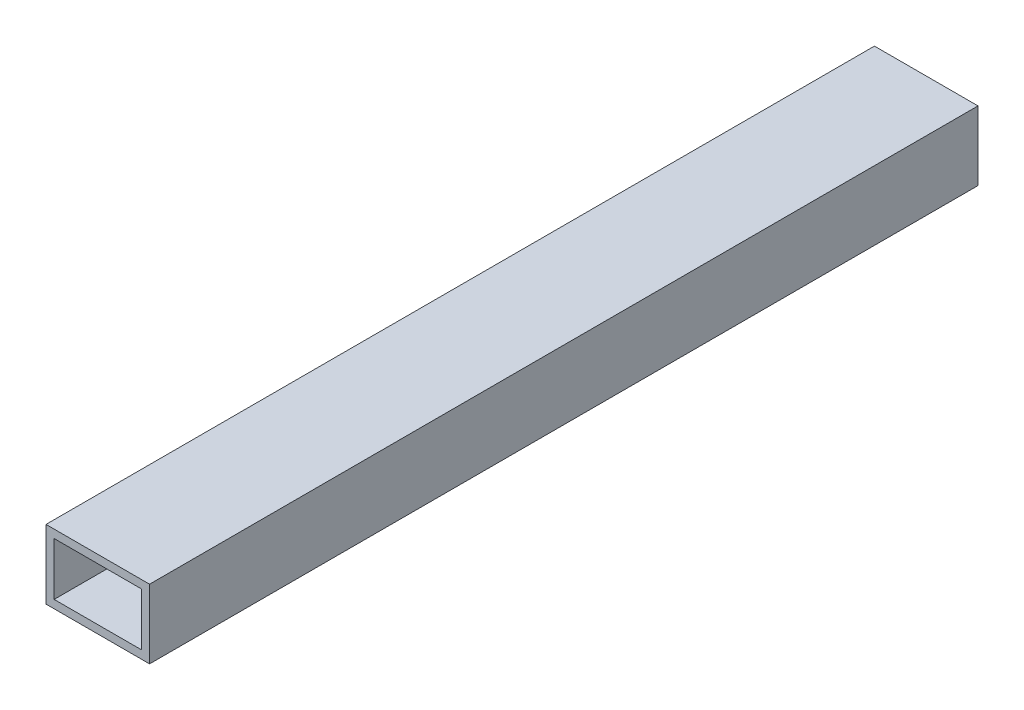
ISO-10303-21;
HEADER;
FILE_DESCRIPTION(('STEP AP214'),'2;1');
FILE_NAME('part.step','',(''),(''),'','','');
FILE_SCHEMA(('AUTOMOTIVE_DESIGN { 1 0 10303 214 1 1 1 1 }'));
ENDSEC;
DATA;
#1=APPLICATION_CONTEXT('core data for automotive mechanical design processes');
#2=APPLICATION_PROTOCOL_DEFINITION('international standard','automotive_design',2000,#1);
#3=PRODUCT_CONTEXT('',#1,'mechanical');
#4=PRODUCT('Part','Part','',(#3));
#5=PRODUCT_RELATED_PRODUCT_CATEGORY('part','',(#4));
#6=PRODUCT_DEFINITION_FORMATION('','',#4);
#7=PRODUCT_DEFINITION_CONTEXT('part definition',#1,'design');
#8=PRODUCT_DEFINITION('design','',#6,#7);
#9=PRODUCT_DEFINITION_SHAPE('','',#8);
#10=(LENGTH_UNIT() NAMED_UNIT(*) SI_UNIT(.MILLI.,.METRE.));
#11=(NAMED_UNIT(*) PLANE_ANGLE_UNIT() SI_UNIT($,.RADIAN.));
#12=(NAMED_UNIT(*) SI_UNIT($,.STERADIAN.) SOLID_ANGLE_UNIT());
#13=UNCERTAINTY_MEASURE_WITH_UNIT(LENGTH_MEASURE(1.E-05),#10,'distance_accuracy_value','');
#14=(GEOMETRIC_REPRESENTATION_CONTEXT(3) GLOBAL_UNCERTAINTY_ASSIGNED_CONTEXT((#13)) GLOBAL_UNIT_ASSIGNED_CONTEXT((#10,
#11,#12)) REPRESENTATION_CONTEXT('',''));
#15=CARTESIAN_POINT('',(0.,0.,0.));
#16=DIRECTION('',(0.,0.,1.));
#17=DIRECTION('',(1.,0.,0.));
#18=AXIS2_PLACEMENT_3D('',#15,#16,#17);
#19=CARTESIAN_POINT('',(0.,0.,609.6));
#20=DIRECTION('',(0.,0.,-1.));
#21=DIRECTION('',(-1.,0.,0.));
#22=AXIS2_PLACEMENT_3D('',#19,#20,#21);
#23=PLANE('',#22);
#24=DIRECTION('',(0.,1.,0.));
#25=VECTOR('',#24,1.);
#26=CARTESIAN_POINT('',(38.1,-25.4,609.6));
#27=LINE('',#26,#25);
#28=CARTESIAN_POINT('',(38.1,-25.4,609.6));
#29=VERTEX_POINT('',#28);
#30=CARTESIAN_POINT('',(38.1,25.4,609.6));
#31=VERTEX_POINT('',#30);
#32=EDGE_CURVE('E134',#29,#31,#27,.T.);
#33=ORIENTED_EDGE('',*,*,#32,.T.);
#34=DIRECTION('',(-1.,0.,0.));
#35=VECTOR('',#34,1.);
#36=CARTESIAN_POINT('',(-38.1,25.4,609.6));
#37=LINE('',#36,#35);
#38=CARTESIAN_POINT('',(-38.1,25.4,609.6));
#39=VERTEX_POINT('',#38);
#40=EDGE_CURVE('E137',#31,#39,#37,.T.);
#41=ORIENTED_EDGE('',*,*,#40,.T.);
#42=DIRECTION('',(0.,-1.,0.));
#43=VECTOR('',#42,1.);
#44=CARTESIAN_POINT('',(-38.1,-25.4,609.6));
#45=LINE('',#44,#43);
#46=CARTESIAN_POINT('',(-38.1,-25.4,609.6));
#47=VERTEX_POINT('',#46);
#48=EDGE_CURVE('E140',#39,#47,#45,.T.);
#49=ORIENTED_EDGE('',*,*,#48,.T.);
#50=DIRECTION('',(1.,0.,0.));
#51=VECTOR('',#50,1.);
#52=CARTESIAN_POINT('',(-38.1,-25.4,609.6));
#53=LINE('',#52,#51);
#54=EDGE_CURVE('E142',#47,#29,#53,.T.);
#55=ORIENTED_EDGE('',*,*,#54,.T.);
#56=EDGE_LOOP('',(#33,#41,#49,#55));
#57=FACE_BOUND('',#56,.T.);
#58=DIRECTION('',(0.,1.,0.));
#59=VECTOR('',#58,1.);
#60=CARTESIAN_POINT('',(32.100000062,-19.400000062,609.6));
#61=LINE('',#60,#59);
#62=CARTESIAN_POINT('',(32.100000062,-19.400000062,609.6));
#63=VERTEX_POINT('',#62);
#64=CARTESIAN_POINT('',(32.100000062,19.400000062,609.6));
#65=VERTEX_POINT('',#64);
#66=EDGE_CURVE('E98',#63,#65,#61,.T.);
#67=ORIENTED_EDGE('',*,*,#66,.F.);
#68=DIRECTION('',(1.,0.,0.));
#69=VECTOR('',#68,1.);
#70=CARTESIAN_POINT('',(-32.100000062,-19.400000062,609.6));
#71=LINE('',#70,#69);
#72=CARTESIAN_POINT('',(-32.100000062,-19.400000062,609.6));
#73=VERTEX_POINT('',#72);
#74=EDGE_CURVE('E120',#73,#63,#71,.T.);
#75=ORIENTED_EDGE('',*,*,#74,.F.);
#76=DIRECTION('',(0.,-1.,0.));
#77=VECTOR('',#76,1.);
#78=CARTESIAN_POINT('',(-32.100000062,-19.400000062,609.6));
#79=LINE('',#78,#77);
#80=CARTESIAN_POINT('',(-32.100000062,19.400000062,609.6));
#81=VERTEX_POINT('',#80);
#82=EDGE_CURVE('E118',#81,#73,#79,.T.);
#83=ORIENTED_EDGE('',*,*,#82,.F.);
#84=DIRECTION('',(-1.,0.,0.));
#85=VECTOR('',#84,1.);
#86=CARTESIAN_POINT('',(-32.100000062,19.400000062,609.6));
#87=LINE('',#86,#85);
#88=EDGE_CURVE('E106',#65,#81,#87,.T.);
#89=ORIENTED_EDGE('',*,*,#88,.F.);
#90=EDGE_LOOP('',(#67,#75,#83,#89));
#91=FACE_BOUND('',#90,.T.);
#92=ADVANCED_FACE('F33',(#57,#91),#23,.F.);
#93=CARTESIAN_POINT('',(0.,0.,0.));
#94=DIRECTION('',(0.,0.,-1.));
#95=DIRECTION('',(-1.,0.,0.));
#96=AXIS2_PLACEMENT_3D('',#93,#94,#95);
#97=PLANE('',#96);
#98=DIRECTION('',(0.,1.,0.));
#99=VECTOR('',#98,1.);
#100=CARTESIAN_POINT('',(38.1,-25.4,0.));
#101=LINE('',#100,#99);
#102=CARTESIAN_POINT('',(38.1,-25.4,0.));
#103=VERTEX_POINT('',#102);
#104=CARTESIAN_POINT('',(38.1,25.4,0.));
#105=VERTEX_POINT('',#104);
#106=EDGE_CURVE('E114',#103,#105,#101,.T.);
#107=ORIENTED_EDGE('',*,*,#106,.F.);
#108=DIRECTION('',(1.,0.,0.));
#109=VECTOR('',#108,1.);
#110=CARTESIAN_POINT('',(-38.1,-25.4,0.));
#111=LINE('',#110,#109);
#112=CARTESIAN_POINT('',(-38.1,-25.4,0.));
#113=VERTEX_POINT('',#112);
#114=EDGE_CURVE('E138',#113,#103,#111,.T.);
#115=ORIENTED_EDGE('',*,*,#114,.F.);
#116=DIRECTION('',(0.,-1.,0.));
#117=VECTOR('',#116,1.);
#118=CARTESIAN_POINT('',(-38.1,-25.4,0.));
#119=LINE('',#118,#117);
#120=CARTESIAN_POINT('',(-38.1,25.4,0.));
#121=VERTEX_POINT('',#120);
#122=EDGE_CURVE('E149',#121,#113,#119,.T.);
#123=ORIENTED_EDGE('',*,*,#122,.F.);
#124=DIRECTION('',(-1.,0.,0.));
#125=VECTOR('',#124,1.);
#126=CARTESIAN_POINT('',(-38.1,25.4,0.));
#127=LINE('',#126,#125);
#128=EDGE_CURVE('E147',#105,#121,#127,.T.);
#129=ORIENTED_EDGE('',*,*,#128,.F.);
#130=EDGE_LOOP('',(#107,#115,#123,#129));
#131=FACE_BOUND('',#130,.T.);
#132=DIRECTION('',(1.,0.,0.));
#133=VECTOR('',#132,1.);
#134=CARTESIAN_POINT('',(-32.100000062,-19.400000062,0.));
#135=LINE('',#134,#133);
#136=CARTESIAN_POINT('',(-32.100000062,-19.400000062,0.));
#137=VERTEX_POINT('',#136);
#138=CARTESIAN_POINT('',(32.100000062,-19.400000062,0.));
#139=VERTEX_POINT('',#138);
#140=EDGE_CURVE('E107',#137,#139,#135,.T.);
#141=ORIENTED_EDGE('',*,*,#140,.T.);
#142=DIRECTION('',(0.,1.,0.));
#143=VECTOR('',#142,1.);
#144=CARTESIAN_POINT('',(32.100000062,-19.400000062,0.));
#145=LINE('',#144,#143);
#146=CARTESIAN_POINT('',(32.100000062,19.400000062,0.));
#147=VERTEX_POINT('',#146);
#148=EDGE_CURVE('E56',#139,#147,#145,.T.);
#149=ORIENTED_EDGE('',*,*,#148,.T.);
#150=DIRECTION('',(-1.,0.,0.));
#151=VECTOR('',#150,1.);
#152=CARTESIAN_POINT('',(-32.100000062,19.400000062,0.));
#153=LINE('',#152,#151);
#154=CARTESIAN_POINT('',(-32.100000062,19.400000062,0.));
#155=VERTEX_POINT('',#154);
#156=EDGE_CURVE('E113',#147,#155,#153,.T.);
#157=ORIENTED_EDGE('',*,*,#156,.T.);
#158=DIRECTION('',(0.,-1.,0.));
#159=VECTOR('',#158,1.);
#160=CARTESIAN_POINT('',(-32.100000062,-19.400000062,0.));
#161=LINE('',#160,#159);
#162=EDGE_CURVE('E126',#155,#137,#161,.T.);
#163=ORIENTED_EDGE('',*,*,#162,.T.);
#164=EDGE_LOOP('',(#141,#149,#157,#163));
#165=FACE_BOUND('',#164,.T.);
#166=ADVANCED_FACE('F167',(#131,#165),#97,.T.);
#167=CARTESIAN_POINT('',(38.1,-25.4,609.6));
#168=DIRECTION('',(-1.,0.,0.));
#169=DIRECTION('',(0.,0.,1.));
#170=AXIS2_PLACEMENT_3D('',#167,#168,#169);
#171=PLANE('',#170);
#172=ORIENTED_EDGE('',*,*,#106,.T.);
#173=DIRECTION('',(0.,0.,-1.));
#174=VECTOR('',#173,1.);
#175=CARTESIAN_POINT('',(38.1,25.4,609.6));
#176=LINE('',#175,#174);
#177=EDGE_CURVE('E11',#31,#105,#176,.T.);
#178=ORIENTED_EDGE('',*,*,#177,.F.);
#179=ORIENTED_EDGE('',*,*,#32,.F.);
#180=DIRECTION('',(0.,0.,-1.));
#181=VECTOR('',#180,1.);
#182=CARTESIAN_POINT('',(38.1,-25.4,609.6));
#183=LINE('',#182,#181);
#184=EDGE_CURVE('E144',#29,#103,#183,.T.);
#185=ORIENTED_EDGE('',*,*,#184,.T.);
#186=EDGE_LOOP('',(#172,#178,#179,#185));
#187=FACE_BOUND('',#186,.T.);
#188=ADVANCED_FACE('F35',(#187),#171,.F.);
#189=CARTESIAN_POINT('',(-38.1,25.4,609.6));
#190=DIRECTION('',(0.,-1.,0.));
#191=DIRECTION('',(0.,0.,-1.));
#192=AXIS2_PLACEMENT_3D('',#189,#190,#191);
#193=PLANE('',#192);
#194=ORIENTED_EDGE('',*,*,#128,.T.);
#195=DIRECTION('',(0.,0.,-1.));
#196=VECTOR('',#195,1.);
#197=CARTESIAN_POINT('',(-38.1,25.4,609.6));
#198=LINE('',#197,#196);
#199=EDGE_CURVE('E41',#39,#121,#198,.T.);
#200=ORIENTED_EDGE('',*,*,#199,.F.);
#201=ORIENTED_EDGE('',*,*,#40,.F.);
#202=ORIENTED_EDGE('',*,*,#177,.T.);
#203=EDGE_LOOP('',(#194,#200,#201,#202));
#204=FACE_BOUND('',#203,.T.);
#205=ADVANCED_FACE('F177',(#204),#193,.F.);
#206=CARTESIAN_POINT('',(-38.1,-25.4,609.6));
#207=DIRECTION('',(1.,0.,0.));
#208=DIRECTION('',(0.,0.,-1.));
#209=AXIS2_PLACEMENT_3D('',#206,#207,#208);
#210=PLANE('',#209);
#211=ORIENTED_EDGE('',*,*,#122,.T.);
#212=DIRECTION('',(0.,0.,-1.));
#213=VECTOR('',#212,1.);
#214=CARTESIAN_POINT('',(-38.1,-25.4,609.6));
#215=LINE('',#214,#213);
#216=EDGE_CURVE('E154',#47,#113,#215,.T.);
#217=ORIENTED_EDGE('',*,*,#216,.F.);
#218=ORIENTED_EDGE('',*,*,#48,.F.);
#219=ORIENTED_EDGE('',*,*,#199,.T.);
#220=EDGE_LOOP('',(#211,#217,#218,#219));
#221=FACE_BOUND('',#220,.T.);
#222=ADVANCED_FACE('F161',(#221),#210,.F.);
#223=CARTESIAN_POINT('',(-38.1,-25.4,609.6));
#224=DIRECTION('',(0.,1.,0.));
#225=DIRECTION('',(0.,0.,1.));
#226=AXIS2_PLACEMENT_3D('',#223,#224,#225);
#227=PLANE('',#226);
#228=ORIENTED_EDGE('',*,*,#114,.T.);
#229=ORIENTED_EDGE('',*,*,#184,.F.);
#230=ORIENTED_EDGE('',*,*,#54,.F.);
#231=ORIENTED_EDGE('',*,*,#216,.T.);
#232=EDGE_LOOP('',(#228,#229,#230,#231));
#233=FACE_BOUND('',#232,.T.);
#234=ADVANCED_FACE('F171',(#233),#227,.F.);
#235=CARTESIAN_POINT('',(32.100000062,-19.400000062,609.6));
#236=DIRECTION('',(-1.,0.,0.));
#237=DIRECTION('',(0.,0.,1.));
#238=AXIS2_PLACEMENT_3D('',#235,#236,#237);
#239=PLANE('',#238);
#240=ORIENTED_EDGE('',*,*,#148,.F.);
#241=DIRECTION('',(0.,0.,-1.));
#242=VECTOR('',#241,1.);
#243=CARTESIAN_POINT('',(32.100000062,-19.400000062,609.6));
#244=LINE('',#243,#242);
#245=EDGE_CURVE('E102',#63,#139,#244,.T.);
#246=ORIENTED_EDGE('',*,*,#245,.F.);
#247=ORIENTED_EDGE('',*,*,#66,.T.);
#248=DIRECTION('',(0.,0.,-1.));
#249=VECTOR('',#248,1.);
#250=CARTESIAN_POINT('',(32.100000062,19.400000062,609.6));
#251=LINE('',#250,#249);
#252=EDGE_CURVE('E101',#65,#147,#251,.T.);
#253=ORIENTED_EDGE('',*,*,#252,.T.);
#254=EDGE_LOOP('',(#240,#246,#247,#253));
#255=FACE_BOUND('',#254,.T.);
#256=ADVANCED_FACE('F100',(#255),#239,.T.);
#257=CARTESIAN_POINT('',(-32.100000062,19.400000062,609.6));
#258=DIRECTION('',(0.,-1.,0.));
#259=DIRECTION('',(0.,0.,-1.));
#260=AXIS2_PLACEMENT_3D('',#257,#258,#259);
#261=PLANE('',#260);
#262=ORIENTED_EDGE('',*,*,#156,.F.);
#263=ORIENTED_EDGE('',*,*,#252,.F.);
#264=ORIENTED_EDGE('',*,*,#88,.T.);
#265=DIRECTION('',(0.,0.,-1.));
#266=VECTOR('',#265,1.);
#267=CARTESIAN_POINT('',(-32.100000062,19.400000062,609.6));
#268=LINE('',#267,#266);
#269=EDGE_CURVE('E115',#81,#155,#268,.T.);
#270=ORIENTED_EDGE('',*,*,#269,.T.);
#271=EDGE_LOOP('',(#262,#263,#264,#270));
#272=FACE_BOUND('',#271,.T.);
#273=ADVANCED_FACE('F110',(#272),#261,.T.);
#274=CARTESIAN_POINT('',(-32.100000062,-19.400000062,609.6));
#275=DIRECTION('',(1.,0.,0.));
#276=DIRECTION('',(0.,0.,-1.));
#277=AXIS2_PLACEMENT_3D('',#274,#275,#276);
#278=PLANE('',#277);
#279=ORIENTED_EDGE('',*,*,#162,.F.);
#280=ORIENTED_EDGE('',*,*,#269,.F.);
#281=ORIENTED_EDGE('',*,*,#82,.T.);
#282=DIRECTION('',(0.,0.,-1.));
#283=VECTOR('',#282,1.);
#284=CARTESIAN_POINT('',(-32.100000062,-19.400000062,609.6));
#285=LINE('',#284,#283);
#286=EDGE_CURVE('E48',#73,#137,#285,.T.);
#287=ORIENTED_EDGE('',*,*,#286,.T.);
#288=EDGE_LOOP('',(#279,#280,#281,#287));
#289=FACE_BOUND('',#288,.T.);
#290=ADVANCED_FACE('F200',(#289),#278,.T.);
#291=CARTESIAN_POINT('',(-32.100000062,-19.400000062,609.6));
#292=DIRECTION('',(0.,1.,0.));
#293=DIRECTION('',(0.,0.,1.));
#294=AXIS2_PLACEMENT_3D('',#291,#292,#293);
#295=PLANE('',#294);
#296=ORIENTED_EDGE('',*,*,#140,.F.);
#297=ORIENTED_EDGE('',*,*,#286,.F.);
#298=ORIENTED_EDGE('',*,*,#74,.T.);
#299=ORIENTED_EDGE('',*,*,#245,.T.);
#300=EDGE_LOOP('',(#296,#297,#298,#299));
#301=FACE_BOUND('',#300,.T.);
#302=ADVANCED_FACE('F204',(#301),#295,.T.);
#303=CLOSED_SHELL('',(#92,#166,#188,#205,#222,#234,#256,#273,#290,#302));
#304=MANIFOLD_SOLID_BREP('B2',#303);
#305=ADVANCED_BREP_SHAPE_REPRESENTATION('',(#18,#304),#14);
#306=SHAPE_DEFINITION_REPRESENTATION(#9,#305);
ENDSEC;
END-ISO-10303-21;
